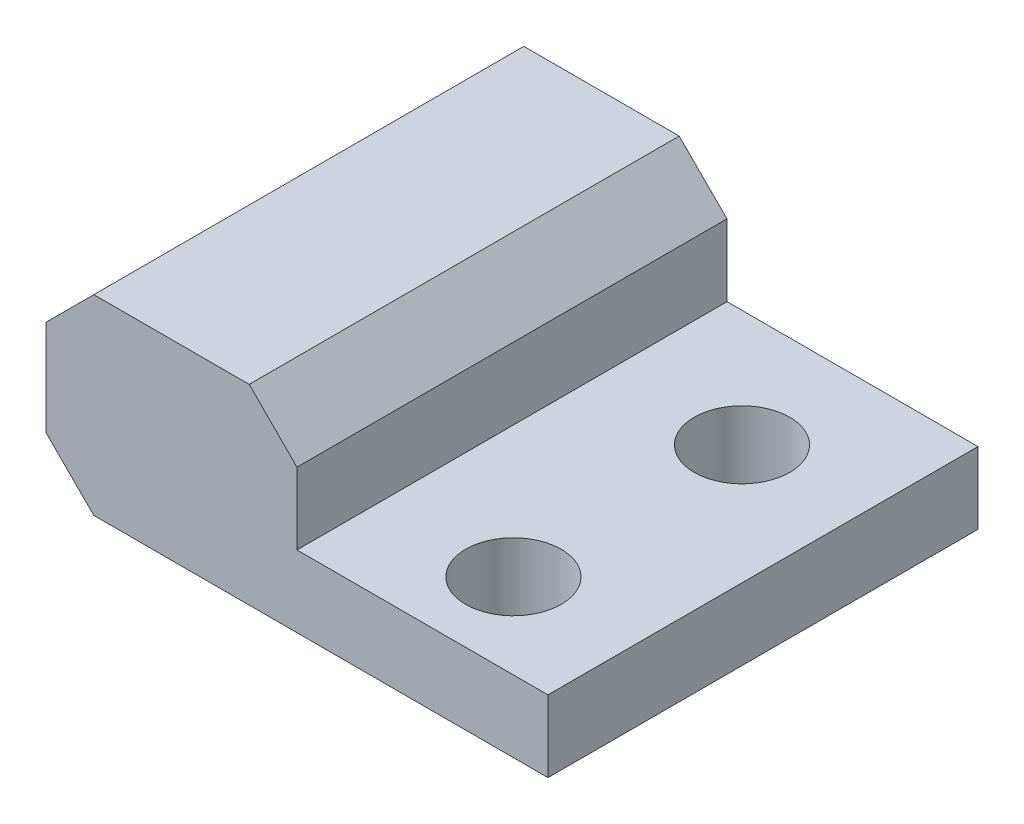
ISO-10303-21;
HEADER;
FILE_DESCRIPTION(('STEP AP214'),'2;1');
FILE_NAME('part.step','',(''),(''),'','','');
FILE_SCHEMA(('AUTOMOTIVE_DESIGN { 1 0 10303 214 1 1 1 1 }'));
ENDSEC;
DATA;
#1=APPLICATION_CONTEXT('core data for automotive mechanical design processes');
#2=APPLICATION_PROTOCOL_DEFINITION('international standard','automotive_design',2000,#1);
#3=PRODUCT_CONTEXT('',#1,'mechanical');
#4=PRODUCT('Part','Part','',(#3));
#5=PRODUCT_RELATED_PRODUCT_CATEGORY('part','',(#4));
#6=PRODUCT_DEFINITION_FORMATION('','',#4);
#7=PRODUCT_DEFINITION_CONTEXT('part definition',#1,'design');
#8=PRODUCT_DEFINITION('design','',#6,#7);
#9=PRODUCT_DEFINITION_SHAPE('','',#8);
#10=(LENGTH_UNIT() NAMED_UNIT(*) SI_UNIT(.MILLI.,.METRE.));
#11=(NAMED_UNIT(*) PLANE_ANGLE_UNIT() SI_UNIT($,.RADIAN.));
#12=(NAMED_UNIT(*) SI_UNIT($,.STERADIAN.) SOLID_ANGLE_UNIT());
#13=UNCERTAINTY_MEASURE_WITH_UNIT(LENGTH_MEASURE(1.E-05),#10,'distance_accuracy_value','');
#14=(GEOMETRIC_REPRESENTATION_CONTEXT(3) GLOBAL_UNCERTAINTY_ASSIGNED_CONTEXT((#13)) GLOBAL_UNIT_ASSIGNED_CONTEXT((#10,
#11,#12)) REPRESENTATION_CONTEXT('',''));
#15=CARTESIAN_POINT('',(0.,0.,0.));
#16=DIRECTION('',(0.,0.,1.));
#17=DIRECTION('',(1.,0.,0.));
#18=AXIS2_PLACEMENT_3D('',#15,#16,#17);
#19=CARTESIAN_POINT('',(-11.,8.,0.));
#20=DIRECTION('',(0.,0.,1.));
#21=DIRECTION('',(1.,0.,0.));
#22=AXIS2_PLACEMENT_3D('',#19,#20,#21);
#23=PLANE('',#22);
#24=DIRECTION('',(-1.,0.,0.));
#25=VECTOR('',#24,1.);
#26=CARTESIAN_POINT('',(-11.,8.,0.));
#27=LINE('',#26,#25);
#28=CARTESIAN_POINT('',(-2.5,8.,0.));
#29=VERTEX_POINT('',#28);
#30=CARTESIAN_POINT('',(-8.99999999999999,8.,0.));
#31=VERTEX_POINT('',#30);
#32=EDGE_CURVE('E138',#29,#31,#27,.T.);
#33=ORIENTED_EDGE('',*,*,#32,.F.);
#34=DIRECTION('',(0.707106781186548,-0.707106781186547,0.));
#35=VECTOR('',#34,1.);
#36=CARTESIAN_POINT('',(-0.5,6.,0.));
#37=LINE('',#36,#35);
#38=CARTESIAN_POINT('',(-0.499999999999999,6.,0.));
#39=VERTEX_POINT('',#38);
#40=EDGE_CURVE('E171',#29,#39,#37,.T.);
#41=ORIENTED_EDGE('',*,*,#40,.T.);
#42=DIRECTION('',(0.,-1.,0.));
#43=VECTOR('',#42,1.);
#44=CARTESIAN_POINT('',(-0.499999999999999,8.,0.));
#45=LINE('',#44,#43);
#46=CARTESIAN_POINT('',(-0.5,3.,0.));
#47=VERTEX_POINT('',#46);
#48=EDGE_CURVE('E122',#39,#47,#45,.T.);
#49=ORIENTED_EDGE('',*,*,#48,.T.);
#50=DIRECTION('',(1.,0.,0.));
#51=VECTOR('',#50,1.);
#52=CARTESIAN_POINT('',(-11.,3.,0.));
#53=LINE('',#52,#51);
#54=CARTESIAN_POINT('',(9.99999999481246,3.,0.));
#55=VERTEX_POINT('',#54);
#56=EDGE_CURVE('E110',#47,#55,#53,.T.);
#57=ORIENTED_EDGE('',*,*,#56,.T.);
#58=DIRECTION('',(0.,-1.,0.));
#59=VECTOR('',#58,1.);
#60=CARTESIAN_POINT('',(10.,8.,0.));
#61=LINE('',#60,#59);
#62=CARTESIAN_POINT('',(10.,0.,0.));
#63=VERTEX_POINT('',#62);
#64=EDGE_CURVE('E149',#55,#63,#61,.T.);
#65=ORIENTED_EDGE('',*,*,#64,.T.);
#66=DIRECTION('',(-1.,0.,0.));
#67=VECTOR('',#66,1.);
#68=CARTESIAN_POINT('',(-11.,0.,0.));
#69=LINE('',#68,#67);
#70=CARTESIAN_POINT('',(-8.99999999999999,0.,0.));
#71=VERTEX_POINT('',#70);
#72=EDGE_CURVE('E139',#63,#71,#69,.T.);
#73=ORIENTED_EDGE('',*,*,#72,.T.);
#74=DIRECTION('',(0.707106781186549,-0.707106781186546,0.));
#75=VECTOR('',#74,1.);
#76=CARTESIAN_POINT('',(-11.,2.,0.));
#77=LINE('',#76,#75);
#78=CARTESIAN_POINT('',(-11.,2.,0.));
#79=VERTEX_POINT('',#78);
#80=EDGE_CURVE('E46',#71,#79,#77,.F.);
#81=ORIENTED_EDGE('',*,*,#80,.T.);
#82=DIRECTION('',(0.,-1.,0.));
#83=VECTOR('',#82,1.);
#84=CARTESIAN_POINT('',(-11.,8.,0.));
#85=LINE('',#84,#83);
#86=CARTESIAN_POINT('',(-11.,5.99999999999999,0.));
#87=VERTEX_POINT('',#86);
#88=EDGE_CURVE('E142',#87,#79,#85,.T.);
#89=ORIENTED_EDGE('',*,*,#88,.F.);
#90=DIRECTION('',(0.707106781186547,0.707106781186548,0.));
#91=VECTOR('',#90,1.);
#92=CARTESIAN_POINT('',(-8.99999999999999,8.,0.));
#93=LINE('',#92,#91);
#94=EDGE_CURVE('E168',#87,#31,#93,.T.);
#95=ORIENTED_EDGE('',*,*,#94,.T.);
#96=EDGE_LOOP('',(#33,#41,#49,#57,#65,#73,#81,#89,#95));
#97=FACE_BOUND('',#96,.T.);
#98=CARTESIAN_POINT('',(-5.50000003202421,4.09074319378488,0.));
#99=DIRECTION('',(0.,0.,1.));
#100=DIRECTION('',(1.,0.,0.));
#101=AXIS2_PLACEMENT_3D('',#98,#99,#100);
#102=CIRCLE('',#101,2.6);
#103=CARTESIAN_POINT('',(-2.90000003202421,4.09074319378488,0.));
#104=VERTEX_POINT('',#103);
#105=EDGE_CURVE('E328',#104,#104,#102,.T.);
#106=ORIENTED_EDGE('',*,*,#105,.T.);
#107=EDGE_LOOP('',(#106));
#108=FACE_BOUND('',#107,.T.);
#109=ADVANCED_FACE('F31',(#97,#108),#23,.F.);
#110=CARTESIAN_POINT('',(-11.,8.,0.));
#111=DIRECTION('',(1.,0.,0.));
#112=DIRECTION('',(0.,0.,-1.));
#113=AXIS2_PLACEMENT_3D('',#110,#111,#112);
#114=PLANE('',#113);
#115=ORIENTED_EDGE('',*,*,#88,.T.);
#116=DIRECTION('',(0.,0.,1.));
#117=VECTOR('',#116,1.);
#118=CARTESIAN_POINT('',(-11.,2.,0.));
#119=LINE('',#118,#117);
#120=CARTESIAN_POINT('',(-11.,2.,17.9908558047486));
#121=VERTEX_POINT('',#120);
#122=EDGE_CURVE('E39',#79,#121,#119,.T.);
#123=ORIENTED_EDGE('',*,*,#122,.T.);
#124=DIRECTION('',(0.,-1.,0.));
#125=VECTOR('',#124,1.);
#126=CARTESIAN_POINT('',(-11.,8.,17.9908558047486));
#127=LINE('',#126,#125);
#128=CARTESIAN_POINT('',(-11.,5.99999999999999,17.9908558047486));
#129=VERTEX_POINT('',#128);
#130=EDGE_CURVE('E152',#129,#121,#127,.T.);
#131=ORIENTED_EDGE('',*,*,#130,.F.);
#132=DIRECTION('',(0.,0.,-1.));
#133=VECTOR('',#132,1.);
#134=CARTESIAN_POINT('',(-11.,5.99999999999999,0.));
#135=LINE('',#134,#133);
#136=EDGE_CURVE('E53',#129,#87,#135,.T.);
#137=ORIENTED_EDGE('',*,*,#136,.T.);
#138=EDGE_LOOP('',(#115,#123,#131,#137));
#139=FACE_BOUND('',#138,.T.);
#140=ADVANCED_FACE('F175',(#139),#114,.F.);
#141=CARTESIAN_POINT('',(-11.,8.,17.9908558047486));
#142=DIRECTION('',(0.,0.,-1.));
#143=DIRECTION('',(-1.,0.,0.));
#144=AXIS2_PLACEMENT_3D('',#141,#142,#143);
#145=PLANE('',#144);
#146=DIRECTION('',(0.,1.,0.));
#147=VECTOR('',#146,1.);
#148=CARTESIAN_POINT('',(-0.5,3.,17.9908558047486));
#149=LINE('',#148,#147);
#150=CARTESIAN_POINT('',(-0.5,3.,17.9908558047486));
#151=VERTEX_POINT('',#150);
#152=CARTESIAN_POINT('',(-0.499999999999999,6.,17.9908558047486));
#153=VERTEX_POINT('',#152);
#154=EDGE_CURVE('E117',#151,#153,#149,.T.);
#155=ORIENTED_EDGE('',*,*,#154,.T.);
#156=DIRECTION('',(-0.707106781186548,0.707106781186547,0.));
#157=VECTOR('',#156,1.);
#158=CARTESIAN_POINT('',(-0.5,6.,17.9908558047486));
#159=LINE('',#158,#157);
#160=CARTESIAN_POINT('',(-2.5,8.,17.9908558047486));
#161=VERTEX_POINT('',#160);
#162=EDGE_CURVE('E161',#153,#161,#159,.T.);
#163=ORIENTED_EDGE('',*,*,#162,.T.);
#164=DIRECTION('',(1.,0.,0.));
#165=VECTOR('',#164,1.);
#166=CARTESIAN_POINT('',(-11.,8.,17.9908558047486));
#167=LINE('',#166,#165);
#168=CARTESIAN_POINT('',(-8.99999999999999,8.,17.9908558047486));
#169=VERTEX_POINT('',#168);
#170=EDGE_CURVE('E135',#169,#161,#167,.T.);
#171=ORIENTED_EDGE('',*,*,#170,.F.);
#172=DIRECTION('',(-0.707106781186547,-0.707106781186548,0.));
#173=VECTOR('',#172,1.);
#174=CARTESIAN_POINT('',(-8.99999999999999,8.,17.9908558047486));
#175=LINE('',#174,#173);
#176=EDGE_CURVE('E157',#169,#129,#175,.T.);
#177=ORIENTED_EDGE('',*,*,#176,.T.);
#178=ORIENTED_EDGE('',*,*,#130,.T.);
#179=DIRECTION('',(-0.707106781186549,0.707106781186546,0.));
#180=VECTOR('',#179,1.);
#181=CARTESIAN_POINT('',(-11.,2.,17.9908558047486));
#182=LINE('',#181,#180);
#183=CARTESIAN_POINT('',(-8.99999999999999,0.,17.9908558047486));
#184=VERTEX_POINT('',#183);
#185=EDGE_CURVE('E159',#121,#184,#182,.F.);
#186=ORIENTED_EDGE('',*,*,#185,.T.);
#187=DIRECTION('',(1.,0.,0.));
#188=VECTOR('',#187,1.);
#189=CARTESIAN_POINT('',(-11.,0.,17.9908558047486));
#190=LINE('',#189,#188);
#191=CARTESIAN_POINT('',(10.,0.,17.9908558047486));
#192=VERTEX_POINT('',#191);
#193=EDGE_CURVE('E134',#184,#192,#190,.T.);
#194=ORIENTED_EDGE('',*,*,#193,.T.);
#195=DIRECTION('',(0.,-1.,0.));
#196=VECTOR('',#195,1.);
#197=CARTESIAN_POINT('',(10.,8.,17.9908558047486));
#198=LINE('',#197,#196);
#199=CARTESIAN_POINT('',(9.99999999481246,3.,17.9908558047486));
#200=VERTEX_POINT('',#199);
#201=EDGE_CURVE('E128',#200,#192,#198,.T.);
#202=ORIENTED_EDGE('',*,*,#201,.F.);
#203=DIRECTION('',(1.,0.,0.));
#204=VECTOR('',#203,1.);
#205=CARTESIAN_POINT('',(-0.5,3.,17.9908558047486));
#206=LINE('',#205,#204);
#207=EDGE_CURVE('E107',#151,#200,#206,.T.);
#208=ORIENTED_EDGE('',*,*,#207,.F.);
#209=EDGE_LOOP('',(#155,#163,#171,#177,#178,#186,#194,#202,#208));
#210=FACE_BOUND('',#209,.T.);
#211=ADVANCED_FACE('F126',(#210),#145,.F.);
#212=CARTESIAN_POINT('',(10.,8.,0.));
#213=DIRECTION('',(-1.,0.,0.));
#214=DIRECTION('',(0.,0.,1.));
#215=AXIS2_PLACEMENT_3D('',#212,#213,#214);
#216=PLANE('',#215);
#217=ORIENTED_EDGE('',*,*,#64,.F.);
#218=DIRECTION('',(0.,0.,-1.));
#219=VECTOR('',#218,1.);
#220=CARTESIAN_POINT('',(9.99999999481246,3.,17.9908558047486));
#221=LINE('',#220,#219);
#222=EDGE_CURVE('E123',#200,#55,#221,.T.);
#223=ORIENTED_EDGE('',*,*,#222,.F.);
#224=ORIENTED_EDGE('',*,*,#201,.T.);
#225=DIRECTION('',(0.,0.,-1.));
#226=VECTOR('',#225,1.);
#227=CARTESIAN_POINT('',(10.,0.,0.));
#228=LINE('',#227,#226);
#229=EDGE_CURVE('E144',#192,#63,#228,.T.);
#230=ORIENTED_EDGE('',*,*,#229,.T.);
#231=EDGE_LOOP('',(#217,#223,#224,#230));
#232=FACE_BOUND('',#231,.T.);
#233=ADVANCED_FACE('F211',(#232),#216,.F.);
#234=CARTESIAN_POINT('',(-11.,8.,17.9908558047486));
#235=DIRECTION('',(0.,1.,0.));
#236=DIRECTION('',(0.,0.,1.));
#237=AXIS2_PLACEMENT_3D('',#234,#235,#236);
#238=PLANE('',#237);
#239=ORIENTED_EDGE('',*,*,#170,.T.);
#240=DIRECTION('',(0.,0.,-1.));
#241=VECTOR('',#240,1.);
#242=CARTESIAN_POINT('',(-2.5,8.,0.));
#243=LINE('',#242,#241);
#244=EDGE_CURVE('E166',#161,#29,#243,.T.);
#245=ORIENTED_EDGE('',*,*,#244,.T.);
#246=ORIENTED_EDGE('',*,*,#32,.T.);
#247=DIRECTION('',(0.,0.,1.));
#248=VECTOR('',#247,1.);
#249=CARTESIAN_POINT('',(-8.99999999999999,8.,17.9908558047486));
#250=LINE('',#249,#248);
#251=EDGE_CURVE('E163',#31,#169,#250,.T.);
#252=ORIENTED_EDGE('',*,*,#251,.T.);
#253=EDGE_LOOP('',(#239,#245,#246,#252));
#254=FACE_BOUND('',#253,.T.);
#255=ADVANCED_FACE('F183',(#254),#238,.T.);
#256=CARTESIAN_POINT('',(-11.,0.,17.9908558047486));
#257=DIRECTION('',(0.,1.,0.));
#258=DIRECTION('',(0.,0.,1.));
#259=AXIS2_PLACEMENT_3D('',#256,#257,#258);
#260=PLANE('',#259);
#261=CARTESIAN_POINT('',(4.99999999481206,0.,4.87358379755558));
#262=DIRECTION('',(0.,1.,0.));
#263=DIRECTION('',(0.,0.,1.));
#264=AXIS2_PLACEMENT_3D('',#261,#262,#263);
#265=CIRCLE('',#264,1.99999994245589);
#266=CARTESIAN_POINT('',(4.99999999481206,0.,6.87358374001147));
#267=VERTEX_POINT('',#266);
#268=EDGE_CURVE('E333',#267,#267,#265,.T.);
#269=ORIENTED_EDGE('',*,*,#268,.T.);
#270=EDGE_LOOP('',(#269));
#271=FACE_BOUND('',#270,.T.);
#272=CARTESIAN_POINT('',(4.99999999481206,0.,14.4361185859939));
#273=DIRECTION('',(0.,1.,0.));
#274=DIRECTION('',(0.,0.,1.));
#275=AXIS2_PLACEMENT_3D('',#272,#273,#274);
#276=CIRCLE('',#275,1.99999988156109);
#277=CARTESIAN_POINT('',(4.99999999481206,0.,16.4361184675549));
#278=VERTEX_POINT('',#277);
#279=EDGE_CURVE('E113',#278,#278,#276,.T.);
#280=ORIENTED_EDGE('',*,*,#279,.T.);
#281=EDGE_LOOP('',(#280));
#282=FACE_BOUND('',#281,.T.);
#283=ORIENTED_EDGE('',*,*,#193,.F.);
#284=DIRECTION('',(0.,0.,-1.));
#285=VECTOR('',#284,1.);
#286=CARTESIAN_POINT('',(-8.99999999999999,0.,17.9908558047486));
#287=LINE('',#286,#285);
#288=EDGE_CURVE('E11',#184,#71,#287,.T.);
#289=ORIENTED_EDGE('',*,*,#288,.T.);
#290=ORIENTED_EDGE('',*,*,#72,.F.);
#291=ORIENTED_EDGE('',*,*,#229,.F.);
#292=EDGE_LOOP('',(#283,#289,#290,#291));
#293=FACE_BOUND('',#292,.T.);
#294=ADVANCED_FACE('F209',(#271,#282,#293),#260,.F.);
#295=CARTESIAN_POINT('',(-0.5,3.,-0.00351336228412991));
#296=DIRECTION('',(0.,-1.,0.));
#297=DIRECTION('',(0.,0.,-1.));
#298=AXIS2_PLACEMENT_3D('',#295,#296,#297);
#299=PLANE('',#298);
#300=CARTESIAN_POINT('',(4.99999999481206,3.,4.87358379755558));
#301=DIRECTION('',(0.,1.,0.));
#302=DIRECTION('',(0.,0.,1.));
#303=AXIS2_PLACEMENT_3D('',#300,#301,#302);
#304=CIRCLE('',#303,1.99999994245589);
#305=CARTESIAN_POINT('',(4.99999999481206,3.,6.87358374001147));
#306=VERTEX_POINT('',#305);
#307=EDGE_CURVE('E330',#306,#306,#304,.T.);
#308=ORIENTED_EDGE('',*,*,#307,.F.);
#309=EDGE_LOOP('',(#308));
#310=FACE_BOUND('',#309,.T.);
#311=CARTESIAN_POINT('',(4.99999999481206,3.,14.4361185859939));
#312=DIRECTION('',(0.,1.,0.));
#313=DIRECTION('',(0.,0.,1.));
#314=AXIS2_PLACEMENT_3D('',#311,#312,#313);
#315=CIRCLE('',#314,1.99999988156109);
#316=CARTESIAN_POINT('',(4.99999999481206,3.,16.4361184675549));
#317=VERTEX_POINT('',#316);
#318=EDGE_CURVE('E336',#317,#317,#315,.T.);
#319=ORIENTED_EDGE('',*,*,#318,.F.);
#320=EDGE_LOOP('',(#319));
#321=FACE_BOUND('',#320,.T.);
#322=DIRECTION('',(0.,0.,1.));
#323=VECTOR('',#322,1.);
#324=CARTESIAN_POINT('',(-0.5,3.,17.9908558047486));
#325=LINE('',#324,#323);
#326=EDGE_CURVE('E103',#47,#151,#325,.T.);
#327=ORIENTED_EDGE('',*,*,#326,.T.);
#328=ORIENTED_EDGE('',*,*,#207,.T.);
#329=ORIENTED_EDGE('',*,*,#222,.T.);
#330=ORIENTED_EDGE('',*,*,#56,.F.);
#331=EDGE_LOOP('',(#327,#328,#329,#330));
#332=FACE_BOUND('',#331,.T.);
#333=ADVANCED_FACE('F105',(#310,#321,#332),#299,.F.);
#334=CARTESIAN_POINT('',(-0.5,3.,17.9908558047486));
#335=DIRECTION('',(-1.,0.,0.));
#336=DIRECTION('',(0.,0.,1.));
#337=AXIS2_PLACEMENT_3D('',#334,#335,#336);
#338=PLANE('',#337);
#339=ORIENTED_EDGE('',*,*,#48,.F.);
#340=DIRECTION('',(0.,0.,1.));
#341=VECTOR('',#340,1.);
#342=CARTESIAN_POINT('',(-0.5,6.,17.9908558047486));
#343=LINE('',#342,#341);
#344=EDGE_CURVE('E120',#39,#153,#343,.T.);
#345=ORIENTED_EDGE('',*,*,#344,.T.);
#346=ORIENTED_EDGE('',*,*,#154,.F.);
#347=ORIENTED_EDGE('',*,*,#326,.F.);
#348=EDGE_LOOP('',(#339,#345,#346,#347));
#349=FACE_BOUND('',#348,.T.);
#350=ADVANCED_FACE('F118',(#349),#338,.F.);
#351=CARTESIAN_POINT('',(4.99999999481206,0.,14.4361185859939));
#352=DIRECTION('',(0.,1.,0.));
#353=DIRECTION('',(0.,0.,1.));
#354=AXIS2_PLACEMENT_3D('',#351,#352,#353);
#355=CYLINDRICAL_SURFACE('',#354,1.99999988156109);
#356=ORIENTED_EDGE('',*,*,#279,.F.);
#357=EDGE_LOOP('',(#356));
#358=FACE_BOUND('',#357,.T.);
#359=ORIENTED_EDGE('',*,*,#318,.T.);
#360=EDGE_LOOP('',(#359));
#361=FACE_BOUND('',#360,.T.);
#362=ADVANCED_FACE('F249',(#358,#361),#355,.F.);
#363=CARTESIAN_POINT('',(4.99999999481206,0.,4.87358379755558));
#364=DIRECTION('',(0.,1.,0.));
#365=DIRECTION('',(0.,0.,1.));
#366=AXIS2_PLACEMENT_3D('',#363,#364,#365);
#367=CYLINDRICAL_SURFACE('',#366,1.99999994245589);
#368=ORIENTED_EDGE('',*,*,#268,.F.);
#369=EDGE_LOOP('',(#368));
#370=FACE_BOUND('',#369,.T.);
#371=ORIENTED_EDGE('',*,*,#307,.T.);
#372=EDGE_LOOP('',(#371));
#373=FACE_BOUND('',#372,.T.);
#374=ADVANCED_FACE('F255',(#370,#373),#367,.F.);
#375=CARTESIAN_POINT('',(-5.50000003202421,4.09074319378488,15.));
#376=DIRECTION('',(0.,0.,-1.));
#377=DIRECTION('',(-1.,0.,0.));
#378=AXIS2_PLACEMENT_3D('',#375,#376,#377);
#379=CYLINDRICAL_SURFACE('',#378,2.6);
#380=CARTESIAN_POINT('',(-5.50000003202421,4.09074319378488,15.));
#381=DIRECTION('',(0.,0.,1.));
#382=DIRECTION('',(1.,0.,0.));
#383=AXIS2_PLACEMENT_3D('',#380,#381,#382);
#384=CIRCLE('',#383,2.6);
#385=CARTESIAN_POINT('',(-2.90000003202421,4.09074319378488,15.));
#386=VERTEX_POINT('',#385);
#387=EDGE_CURVE('E325',#386,#386,#384,.T.);
#388=ORIENTED_EDGE('',*,*,#387,.T.);
#389=EDGE_LOOP('',(#388));
#390=FACE_BOUND('',#389,.T.);
#391=ORIENTED_EDGE('',*,*,#105,.F.);
#392=EDGE_LOOP('',(#391));
#393=FACE_BOUND('',#392,.T.);
#394=ADVANCED_FACE('F198',(#390,#393),#379,.F.);
#395=CARTESIAN_POINT('',(-5.50000003202421,4.09074319378488,15.));
#396=DIRECTION('',(0.,0.,1.));
#397=DIRECTION('',(1.,0.,0.));
#398=AXIS2_PLACEMENT_3D('',#395,#396,#397);
#399=PLANE('',#398);
#400=ORIENTED_EDGE('',*,*,#387,.F.);
#401=EDGE_LOOP('',(#400));
#402=FACE_BOUND('',#401,.T.);
#403=ADVANCED_FACE('F192',(#402),#399,.F.);
#404=CARTESIAN_POINT('',(-0.5,6.,17.9908558047486));
#405=DIRECTION('',(0.707106781186547,0.707106781186548,0.));
#406=DIRECTION('',(-0.707106781186548,0.707106781186547,0.));
#407=AXIS2_PLACEMENT_3D('',#404,#405,#406);
#408=PLANE('',#407);
#409=ORIENTED_EDGE('',*,*,#40,.F.);
#410=ORIENTED_EDGE('',*,*,#244,.F.);
#411=ORIENTED_EDGE('',*,*,#162,.F.);
#412=ORIENTED_EDGE('',*,*,#344,.F.);
#413=EDGE_LOOP('',(#409,#410,#411,#412));
#414=FACE_BOUND('',#413,.T.);
#415=ADVANCED_FACE('F189',(#414),#408,.T.);
#416=CARTESIAN_POINT('',(-11.,2.,0.));
#417=DIRECTION('',(0.707106781186546,0.707106781186549,0.));
#418=DIRECTION('',(-0.707106781186549,0.707106781186546,0.));
#419=AXIS2_PLACEMENT_3D('',#416,#417,#418);
#420=PLANE('',#419);
#421=ORIENTED_EDGE('',*,*,#80,.F.);
#422=ORIENTED_EDGE('',*,*,#288,.F.);
#423=ORIENTED_EDGE('',*,*,#185,.F.);
#424=ORIENTED_EDGE('',*,*,#122,.F.);
#425=EDGE_LOOP('',(#421,#422,#423,#424));
#426=FACE_BOUND('',#425,.T.);
#427=ADVANCED_FACE('F191',(#426),#420,.F.);
#428=CARTESIAN_POINT('',(-8.99999999999999,8.,17.9908558047486));
#429=DIRECTION('',(-0.707106781186548,0.707106781186547,0.));
#430=DIRECTION('',(-0.707106781186547,-0.707106781186548,0.));
#431=AXIS2_PLACEMENT_3D('',#428,#429,#430);
#432=PLANE('',#431);
#433=ORIENTED_EDGE('',*,*,#94,.F.);
#434=ORIENTED_EDGE('',*,*,#136,.F.);
#435=ORIENTED_EDGE('',*,*,#176,.F.);
#436=ORIENTED_EDGE('',*,*,#251,.F.);
#437=EDGE_LOOP('',(#433,#434,#435,#436));
#438=FACE_BOUND('',#437,.T.);
#439=ADVANCED_FACE('F33',(#438),#432,.T.);
#440=CLOSED_SHELL('',(#109,#140,#211,#233,#255,#294,#333,#350,#362,#374,#394,#403,#415,#427,#439));
#441=MANIFOLD_SOLID_BREP('B2',#440);
#442=ADVANCED_BREP_SHAPE_REPRESENTATION('',(#18,#441),#14);
#443=SHAPE_DEFINITION_REPRESENTATION(#9,#442);
ENDSEC;
END-ISO-10303-21;
